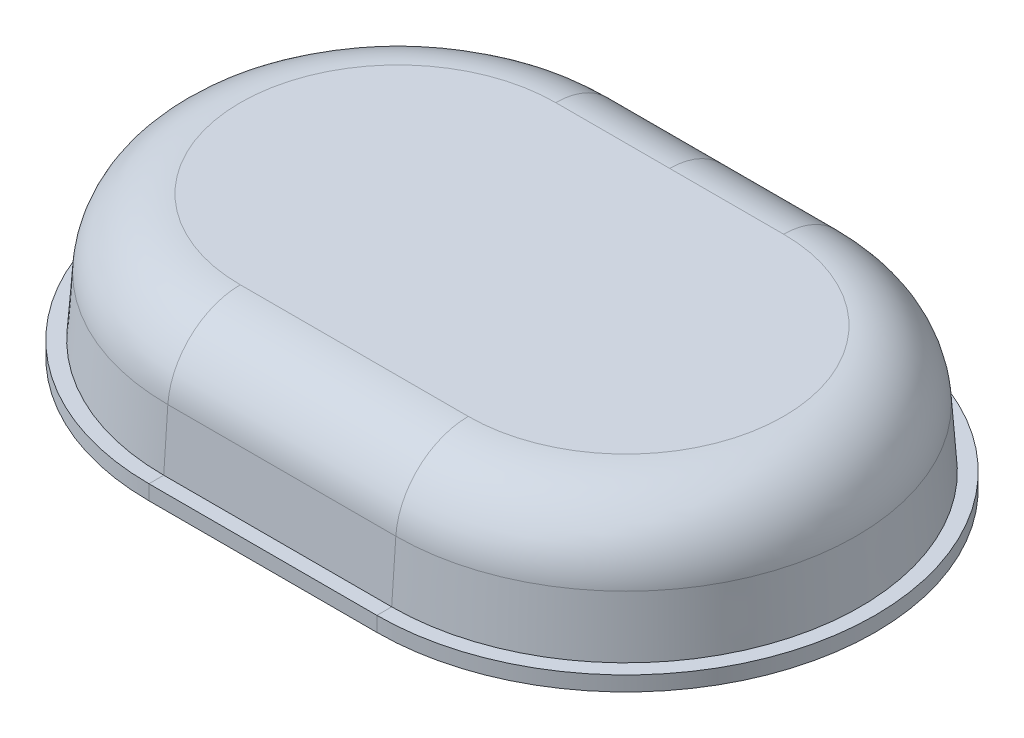
ISO-10303-21;
HEADER;
FILE_DESCRIPTION(('STEP AP214'),'2;1');
FILE_NAME('part.step','',(''),(''),'','','');
FILE_SCHEMA(('AUTOMOTIVE_DESIGN { 1 0 10303 214 1 1 1 1 }'));
ENDSEC;
DATA;
#1=APPLICATION_CONTEXT('core data for automotive mechanical design processes');
#2=APPLICATION_PROTOCOL_DEFINITION('international standard','automotive_design',2000,#1);
#3=PRODUCT_CONTEXT('',#1,'mechanical');
#4=PRODUCT('Part','Part','',(#3));
#5=PRODUCT_RELATED_PRODUCT_CATEGORY('part','',(#4));
#6=PRODUCT_DEFINITION_FORMATION('','',#4);
#7=PRODUCT_DEFINITION_CONTEXT('part definition',#1,'design');
#8=PRODUCT_DEFINITION('design','',#6,#7);
#9=PRODUCT_DEFINITION_SHAPE('','',#8);
#10=(LENGTH_UNIT() NAMED_UNIT(*) SI_UNIT(.MILLI.,.METRE.));
#11=(NAMED_UNIT(*) PLANE_ANGLE_UNIT() SI_UNIT($,.RADIAN.));
#12=(NAMED_UNIT(*) SI_UNIT($,.STERADIAN.) SOLID_ANGLE_UNIT());
#13=UNCERTAINTY_MEASURE_WITH_UNIT(LENGTH_MEASURE(1.E-05),#10,'distance_accuracy_value','');
#14=(GEOMETRIC_REPRESENTATION_CONTEXT(3) GLOBAL_UNCERTAINTY_ASSIGNED_CONTEXT((#13)) GLOBAL_UNIT_ASSIGNED_CONTEXT((#10,
#11,#12)) REPRESENTATION_CONTEXT('',''));
#15=CARTESIAN_POINT('',(0.,0.,0.));
#16=DIRECTION('',(0.,0.,1.));
#17=DIRECTION('',(1.,0.,0.));
#18=AXIS2_PLACEMENT_3D('',#15,#16,#17);
#19=CARTESIAN_POINT('',(-27.,0.,0.));
#20=DIRECTION('',(0.,1.,0.));
#21=DIRECTION('',(0.,0.,1.));
#22=AXIS2_PLACEMENT_3D('',#19,#20,#21);
#23=PLANE('',#22);
#24=DIRECTION('',(-1.,0.,0.));
#25=VECTOR('',#24,1.);
#26=CARTESIAN_POINT('',(-27.,0.,-54.));
#27=LINE('',#26,#25);
#28=CARTESIAN_POINT('',(27.0000000000002,0.,-54.0000000000008));
#29=VERTEX_POINT('',#28);
#30=CARTESIAN_POINT('',(-27.,0.,-54.));
#31=VERTEX_POINT('',#30);
#32=EDGE_CURVE('E289',#29,#31,#27,.T.);
#33=ORIENTED_EDGE('',*,*,#32,.T.);
#34=CARTESIAN_POINT('',(-27.,0.,0.));
#35=DIRECTION('',(0.,1.,0.));
#36=DIRECTION('',(0.,0.,1.));
#37=AXIS2_PLACEMENT_3D('',#34,#35,#36);
#38=CIRCLE('',#37,54.);
#39=CARTESIAN_POINT('',(-27.,0.,54.));
#40=VERTEX_POINT('',#39);
#41=EDGE_CURVE('E292',#31,#40,#38,.T.);
#42=ORIENTED_EDGE('',*,*,#41,.T.);
#43=DIRECTION('',(1.,0.,0.));
#44=VECTOR('',#43,1.);
#45=CARTESIAN_POINT('',(-27.,0.,54.));
#46=LINE('',#45,#44);
#47=CARTESIAN_POINT('',(27.,0.,54.));
#48=VERTEX_POINT('',#47);
#49=EDGE_CURVE('E350',#40,#48,#46,.T.);
#50=ORIENTED_EDGE('',*,*,#49,.T.);
#51=CARTESIAN_POINT('',(27.0000000000014,0.,-5.55111512312578E-13));
#52=DIRECTION('',(0.,1.,0.));
#53=DIRECTION('',(0.,0.,1.));
#54=AXIS2_PLACEMENT_3D('',#51,#52,#53);
#55=CIRCLE('',#54,54.0000000000003);
#56=EDGE_CURVE('E59',#48,#29,#55,.T.);
#57=ORIENTED_EDGE('',*,*,#56,.T.);
#58=EDGE_LOOP('',(#33,#42,#50,#57));
#59=FACE_BOUND('',#58,.T.);
#60=DIRECTION('',(-1.,0.,0.));
#61=VECTOR('',#60,1.);
#62=CARTESIAN_POINT('',(27.,0.,58.9999999999995));
#63=LINE('',#62,#61);
#64=CARTESIAN_POINT('',(27.,0.,58.9999999999993));
#65=VERTEX_POINT('',#64);
#66=CARTESIAN_POINT('',(-27.,0.,58.9999999999997));
#67=VERTEX_POINT('',#66);
#68=EDGE_CURVE('E245',#65,#67,#63,.T.);
#69=ORIENTED_EDGE('',*,*,#68,.T.);
#70=CARTESIAN_POINT('',(-27.,0.,0.));
#71=DIRECTION('',(0.,-1.,0.));
#72=DIRECTION('',(0.,0.,1.));
#73=AXIS2_PLACEMENT_3D('',#70,#71,#72);
#74=CIRCLE('',#73,58.9999999999997);
#75=CARTESIAN_POINT('',(-27.0000000000006,0.,-58.9999999999997));
#76=VERTEX_POINT('',#75);
#77=EDGE_CURVE('E251',#67,#76,#74,.T.);
#78=ORIENTED_EDGE('',*,*,#77,.T.);
#79=DIRECTION('',(1.,0.,0.));
#80=VECTOR('',#79,1.);
#81=CARTESIAN_POINT('',(-27.,0.,-58.9999999999997));
#82=LINE('',#81,#80);
#83=CARTESIAN_POINT('',(0.,0.,-59.));
#84=VERTEX_POINT('',#83);
#85=EDGE_CURVE('E198',#76,#84,#82,.T.);
#86=ORIENTED_EDGE('',*,*,#85,.T.);
#87=DIRECTION('',(1.,0.,0.));
#88=VECTOR('',#87,1.);
#89=CARTESIAN_POINT('',(0.,0.,-59.));
#90=LINE('',#89,#88);
#91=CARTESIAN_POINT('',(27.0000000000002,0.,-59.0000000000003));
#92=VERTEX_POINT('',#91);
#93=EDGE_CURVE('E213',#84,#92,#90,.T.);
#94=ORIENTED_EDGE('',*,*,#93,.T.);
#95=CARTESIAN_POINT('',(27.0000000000014,0.,-5.55111512312578E-13));
#96=DIRECTION('',(0.,-1.,0.));
#97=DIRECTION('',(0.,0.,-1.));
#98=AXIS2_PLACEMENT_3D('',#95,#96,#97);
#99=CIRCLE('',#98,58.9999999999999);
#100=EDGE_CURVE('E232',#92,#65,#99,.T.);
#101=ORIENTED_EDGE('',*,*,#100,.T.);
#102=EDGE_LOOP('',(#69,#78,#86,#94,#101));
#103=FACE_BOUND('',#102,.T.);
#104=ADVANCED_FACE('F35',(#59,#103),#23,.F.);
#105=CARTESIAN_POINT('',(-27.,3.39536528938381,0.));
#106=DIRECTION('',(0.,-1.,0.));
#107=DIRECTION('',(0.,0.,1.));
#108=AXIS2_PLACEMENT_3D('',#105,#106,#107);
#109=CONICAL_SURFACE('',#108,54.0036539246103,0.0698131700797733);
#110=CARTESIAN_POINT('',(-27.,17.3953652893838,0.));
#111=DIRECTION('',(0.,1.,0.));
#112=DIRECTION('',(0.,0.,1.));
#113=AXIS2_PLACEMENT_3D('',#110,#111,#112);
#114=CIRCLE('',#113,53.0246785574007);
#115=CARTESIAN_POINT('',(-27.,17.3953652893838,-53.0246785574007));
#116=VERTEX_POINT('',#115);
#117=CARTESIAN_POINT('',(-27.,17.3953652893838,53.0246785574007));
#118=VERTEX_POINT('',#117);
#119=EDGE_CURVE('E277',#116,#118,#114,.T.);
#120=ORIENTED_EDGE('',*,*,#119,.T.);
#121=DIRECTION('',(0.,-0.997564050259824,0.0697564737441255));
#122=VECTOR('',#121,1.);
#123=CARTESIAN_POINT('',(-27.,3.39536528938381,54.0036539246103));
#124=LINE('',#123,#122);
#125=CARTESIAN_POINT('',(-26.9999999999999,3.44761884576238,54.));
#126=VERTEX_POINT('',#125);
#127=EDGE_CURVE('E290',#118,#126,#124,.T.);
#128=ORIENTED_EDGE('',*,*,#127,.T.);
#129=CARTESIAN_POINT('',(-27.,3.44761884576236,0.));
#130=DIRECTION('',(0.,-1.,0.));
#131=DIRECTION('',(0.,0.,-1.));
#132=AXIS2_PLACEMENT_3D('',#129,#130,#131);
#133=CIRCLE('',#132,54.);
#134=CARTESIAN_POINT('',(-27.0000000000003,3.44761884576232,-54.));
#135=VERTEX_POINT('',#134);
#136=EDGE_CURVE('E285',#135,#126,#133,.F.);
#137=ORIENTED_EDGE('',*,*,#136,.F.);
#138=DIRECTION('',(0.,-0.997564050259824,-0.0697564737441255));
#139=VECTOR('',#138,1.);
#140=CARTESIAN_POINT('',(-27.,3.39536528938381,-54.0036539246103));
#141=LINE('',#140,#139);
#142=EDGE_CURVE('E281',#116,#135,#141,.T.);
#143=ORIENTED_EDGE('',*,*,#142,.F.);
#144=EDGE_LOOP('',(#120,#128,#137,#143));
#145=FACE_BOUND('',#144,.T.);
#146=ADVANCED_FACE('F475',(#145),#109,.F.);
#147=CARTESIAN_POINT('',(-27.,3.39536528938381,54.0036539246103));
#148=DIRECTION('',(0.,0.0697564737441255,0.997564050259824));
#149=DIRECTION('',(0.,-0.997564050259824,0.0697564737441255));
#150=AXIS2_PLACEMENT_3D('',#147,#148,#149);
#151=PLANE('',#150);
#152=DIRECTION('',(1.,0.,0.));
#153=VECTOR('',#152,1.);
#154=CARTESIAN_POINT('',(-26.9999999999998,17.3953652893838,53.0246785574007));
#155=LINE('',#154,#153);
#156=CARTESIAN_POINT('',(27.0000000000001,17.3953652893838,53.0246785574004));
#157=VERTEX_POINT('',#156);
#158=EDGE_CURVE('E294',#118,#157,#155,.T.);
#159=ORIENTED_EDGE('',*,*,#158,.T.);
#160=DIRECTION('',(0.,-0.997564050259824,0.0697564737441255));
#161=VECTOR('',#160,1.);
#162=CARTESIAN_POINT('',(27.0000000000001,3.39536528938381,54.0036539246099));
#163=LINE('',#162,#161);
#164=CARTESIAN_POINT('',(27.0000000000009,3.44761884576043,53.9999999999999));
#165=VERTEX_POINT('',#164);
#166=EDGE_CURVE('E293',#157,#165,#163,.T.);
#167=ORIENTED_EDGE('',*,*,#166,.T.);
#168=DIRECTION('',(-1.,0.,0.));
#169=VECTOR('',#168,1.);
#170=CARTESIAN_POINT('',(-27.,3.44761884576236,54.));
#171=LINE('',#170,#169);
#172=EDGE_CURVE('E288',#126,#165,#171,.F.);
#173=ORIENTED_EDGE('',*,*,#172,.F.);
#174=ORIENTED_EDGE('',*,*,#127,.F.);
#175=EDGE_LOOP('',(#159,#167,#173,#174));
#176=FACE_BOUND('',#175,.T.);
#177=ADVANCED_FACE('F480',(#176),#151,.F.);
#178=CARTESIAN_POINT('',(27.0000000000014,3.39536528938381,-5.55111512312578E-13));
#179=DIRECTION('',(0.,-1.,0.));
#180=DIRECTION('',(0.,0.,1.));
#181=AXIS2_PLACEMENT_3D('',#178,#179,#180);
#182=CONICAL_SURFACE('',#181,54.0036539246105,0.0698131700797733);
#183=CARTESIAN_POINT('',(27.0000000000014,17.3953652893838,-5.55111512312578E-13));
#184=DIRECTION('',(0.,1.,0.));
#185=DIRECTION('',(0.,0.,1.));
#186=AXIS2_PLACEMENT_3D('',#183,#184,#185);
#187=CIRCLE('',#186,53.0246785574009);
#188=CARTESIAN_POINT('',(27.0000000000003,17.3953652893838,-53.0246785574015));
#189=VERTEX_POINT('',#188);
#190=EDGE_CURVE('E301',#157,#189,#187,.T.);
#191=ORIENTED_EDGE('',*,*,#190,.T.);
#192=DIRECTION('',(0.,0.997564050259824,0.0697564737441255));
#193=VECTOR('',#192,1.);
#194=CARTESIAN_POINT('',(27.0000000000003,3.39536528938381,-54.003653924611));
#195=LINE('',#194,#193);
#196=CARTESIAN_POINT('',(27.0000000000005,3.44761884576337,-54.0000000000007));
#197=VERTEX_POINT('',#196);
#198=EDGE_CURVE('E283',#189,#197,#195,.F.);
#199=ORIENTED_EDGE('',*,*,#198,.T.);
#200=CARTESIAN_POINT('',(27.0000000000014,3.44761884576137,-5.55111512312578E-13));
#201=DIRECTION('',(0.,-1.,0.));
#202=DIRECTION('',(0.,0.,-1.));
#203=AXIS2_PLACEMENT_3D('',#200,#201,#202);
#204=CIRCLE('',#203,54.0000000000003);
#205=EDGE_CURVE('E299',#165,#197,#204,.F.);
#206=ORIENTED_EDGE('',*,*,#205,.F.);
#207=ORIENTED_EDGE('',*,*,#166,.F.);
#208=EDGE_LOOP('',(#191,#199,#206,#207));
#209=FACE_BOUND('',#208,.T.);
#210=ADVANCED_FACE('F500',(#209),#182,.F.);
#211=CARTESIAN_POINT('',(27.0000000000002,3.39536528938381,-54.003653924611));
#212=DIRECTION('',(0.,0.0697564737441255,-0.997564050259824));
#213=DIRECTION('',(0.,0.997564050259824,0.0697564737441255));
#214=AXIS2_PLACEMENT_3D('',#211,#212,#213);
#215=PLANE('',#214);
#216=DIRECTION('',(-1.,0.,0.));
#217=VECTOR('',#216,1.);
#218=CARTESIAN_POINT('',(-2.13322755577671E-13,17.3953652893838,-53.0246785574011));
#219=LINE('',#218,#217);
#220=CARTESIAN_POINT('',(0.,17.3953652893838,-53.0246785574011));
#221=VERTEX_POINT('',#220);
#222=EDGE_CURVE('E310',#221,#116,#219,.T.);
#223=ORIENTED_EDGE('',*,*,#222,.T.);
#224=ORIENTED_EDGE('',*,*,#142,.T.);
#225=DIRECTION('',(1.,0.,0.));
#226=VECTOR('',#225,1.);
#227=CARTESIAN_POINT('',(27.0000000000002,3.44761884576435,-54.0000000000006));
#228=LINE('',#227,#226);
#229=EDGE_CURVE('E308',#197,#135,#228,.F.);
#230=ORIENTED_EDGE('',*,*,#229,.F.);
#231=ORIENTED_EDGE('',*,*,#198,.F.);
#232=DIRECTION('',(-1.,0.,0.));
#233=VECTOR('',#232,1.);
#234=CARTESIAN_POINT('',(27.0000000000001,17.3953652893838,-53.0246785574015));
#235=LINE('',#234,#233);
#236=EDGE_CURVE('E284',#189,#221,#235,.T.);
#237=ORIENTED_EDGE('',*,*,#236,.T.);
#238=EDGE_LOOP('',(#223,#224,#230,#231,#237));
#239=FACE_BOUND('',#238,.T.);
#240=ADVANCED_FACE('F505',(#239),#215,.F.);
#241=CARTESIAN_POINT('',(-27.,3.5,0.));
#242=DIRECTION('',(0.,-1.,0.));
#243=DIRECTION('',(0.,0.,-1.));
#244=AXIS2_PLACEMENT_3D('',#241,#242,#243);
#245=CYLINDRICAL_SURFACE('',#244,54.);
#246=ORIENTED_EDGE('',*,*,#41,.F.);
#247=DIRECTION('',(0.,-1.,0.));
#248=VECTOR('',#247,1.);
#249=CARTESIAN_POINT('',(-27.,3.5,-54.));
#250=LINE('',#249,#248);
#251=EDGE_CURVE('E318',#135,#31,#250,.T.);
#252=ORIENTED_EDGE('',*,*,#251,.F.);
#253=ORIENTED_EDGE('',*,*,#136,.T.);
#254=DIRECTION('',(0.,1.,0.));
#255=VECTOR('',#254,1.);
#256=CARTESIAN_POINT('',(-27.,3.5,54.));
#257=LINE('',#256,#255);
#258=EDGE_CURVE('E319',#126,#40,#257,.F.);
#259=ORIENTED_EDGE('',*,*,#258,.T.);
#260=EDGE_LOOP('',(#246,#252,#253,#259));
#261=FACE_BOUND('',#260,.T.);
#262=ADVANCED_FACE('F490',(#261),#245,.F.);
#263=CARTESIAN_POINT('',(-27.,3.5,54.));
#264=DIRECTION('',(0.,0.,-1.));
#265=DIRECTION('',(-1.,0.,0.));
#266=AXIS2_PLACEMENT_3D('',#263,#264,#265);
#267=PLANE('',#266);
#268=ORIENTED_EDGE('',*,*,#49,.F.);
#269=ORIENTED_EDGE('',*,*,#258,.F.);
#270=ORIENTED_EDGE('',*,*,#172,.T.);
#271=DIRECTION('',(0.,-1.,0.));
#272=VECTOR('',#271,1.);
#273=CARTESIAN_POINT('',(27.0000000000001,3.5,53.9999999999997));
#274=LINE('',#273,#272);
#275=EDGE_CURVE('E323',#165,#48,#274,.T.);
#276=ORIENTED_EDGE('',*,*,#275,.T.);
#277=EDGE_LOOP('',(#268,#269,#270,#276));
#278=FACE_BOUND('',#277,.T.);
#279=ADVANCED_FACE('F494',(#278),#267,.T.);
#280=CARTESIAN_POINT('',(27.0000000000014,3.5,-5.55111512312578E-13));
#281=DIRECTION('',(0.,-1.,0.));
#282=DIRECTION('',(0.,0.,-1.));
#283=AXIS2_PLACEMENT_3D('',#280,#281,#282);
#284=CYLINDRICAL_SURFACE('',#283,54.0000000000003);
#285=ORIENTED_EDGE('',*,*,#56,.F.);
#286=ORIENTED_EDGE('',*,*,#275,.F.);
#287=ORIENTED_EDGE('',*,*,#205,.T.);
#288=DIRECTION('',(0.,1.,0.));
#289=VECTOR('',#288,1.);
#290=CARTESIAN_POINT('',(27.0000000000002,3.5,-54.0000000000006));
#291=LINE('',#290,#289);
#292=EDGE_CURVE('E325',#197,#29,#291,.F.);
#293=ORIENTED_EDGE('',*,*,#292,.T.);
#294=EDGE_LOOP('',(#285,#286,#287,#293));
#295=FACE_BOUND('',#294,.T.);
#296=ADVANCED_FACE('F497',(#295),#284,.F.);
#297=CARTESIAN_POINT('',(-27.,3.5,-54.));
#298=DIRECTION('',(0.,0.,1.));
#299=DIRECTION('',(1.,0.,0.));
#300=AXIS2_PLACEMENT_3D('',#297,#298,#299);
#301=PLANE('',#300);
#302=ORIENTED_EDGE('',*,*,#32,.F.);
#303=ORIENTED_EDGE('',*,*,#292,.F.);
#304=ORIENTED_EDGE('',*,*,#229,.T.);
#305=ORIENTED_EDGE('',*,*,#251,.T.);
#306=EDGE_LOOP('',(#302,#303,#304,#305));
#307=FACE_BOUND('',#306,.T.);
#308=ADVANCED_FACE('F486',(#307),#301,.T.);
#309=CARTESIAN_POINT('',(0.,16.30020279808,-37.3631252723959));
#310=DIRECTION('',(-1.,0.,0.));
#311=DIRECTION('',(0.,0.,1.));
#312=AXIS2_PLACEMENT_3D('',#309,#310,#311);
#313=CYLINDRICAL_SURFACE('',#312,15.69979720192);
#314=ORIENTED_EDGE('',*,*,#222,.F.);
#315=CARTESIAN_POINT('',(0.,16.30020279808,-37.3631252723959));
#316=DIRECTION('',(-1.,0.,0.));
#317=DIRECTION('',(0.,0.,1.));
#318=AXIS2_PLACEMENT_3D('',#315,#316,#317);
#319=CIRCLE('',#318,15.69979720192);
#320=CARTESIAN_POINT('',(0.,32.,-37.3631252723959));
#321=VERTEX_POINT('',#320);
#322=EDGE_CURVE('E269',#321,#221,#319,.T.);
#323=ORIENTED_EDGE('',*,*,#322,.F.);
#324=DIRECTION('',(1.,0.,0.));
#325=VECTOR('',#324,1.);
#326=CARTESIAN_POINT('',(-27.,32.,-37.3631252723959));
#327=LINE('',#326,#325);
#328=CARTESIAN_POINT('',(-27.,32.,-37.3631252723956));
#329=VERTEX_POINT('',#328);
#330=EDGE_CURVE('E330',#321,#329,#327,.F.);
#331=ORIENTED_EDGE('',*,*,#330,.T.);
#332=CARTESIAN_POINT('',(-27.,16.30020279808,-37.3631252723956));
#333=DIRECTION('',(1.,0.,0.));
#334=DIRECTION('',(0.,0.,-1.));
#335=AXIS2_PLACEMENT_3D('',#332,#333,#334);
#336=CIRCLE('',#335,15.69979720192);
#337=EDGE_CURVE('E313',#329,#116,#336,.F.);
#338=ORIENTED_EDGE('',*,*,#337,.T.);
#339=EDGE_LOOP('',(#314,#323,#331,#338));
#340=FACE_BOUND('',#339,.T.);
#341=ADVANCED_FACE('F523',(#340),#313,.F.);
#342=CARTESIAN_POINT('',(-27.,16.30020279808,0.));
#343=DIRECTION('',(0.,1.,0.));
#344=DIRECTION('',(0.,0.,1.));
#345=AXIS2_PLACEMENT_3D('',#342,#343,#344);
#346=TOROIDAL_SURFACE('',#345,37.3631252723956,15.69979720192);
#347=ORIENTED_EDGE('',*,*,#119,.F.);
#348=ORIENTED_EDGE('',*,*,#337,.F.);
#349=CARTESIAN_POINT('',(-27.,32.,0.));
#350=DIRECTION('',(0.,1.,0.));
#351=DIRECTION('',(0.,0.,1.));
#352=AXIS2_PLACEMENT_3D('',#349,#350,#351);
#353=CIRCLE('',#352,37.3631252723956);
#354=CARTESIAN_POINT('',(-26.9999999999998,32.,37.3631252723956));
#355=VERTEX_POINT('',#354);
#356=EDGE_CURVE('E312',#329,#355,#353,.T.);
#357=ORIENTED_EDGE('',*,*,#356,.T.);
#358=CARTESIAN_POINT('',(-26.9999999999998,16.30020279808,37.3631252723956));
#359=DIRECTION('',(1.,0.,0.));
#360=DIRECTION('',(0.,0.,-1.));
#361=AXIS2_PLACEMENT_3D('',#358,#359,#360);
#362=CIRCLE('',#361,15.69979720192);
#363=EDGE_CURVE('E280',#355,#118,#362,.T.);
#364=ORIENTED_EDGE('',*,*,#363,.T.);
#365=EDGE_LOOP('',(#347,#348,#357,#364));
#366=FACE_BOUND('',#365,.T.);
#367=ADVANCED_FACE('F525',(#366),#346,.F.);
#368=CARTESIAN_POINT('',(-26.9999999999999,16.30020279808,37.3631252723956));
#369=DIRECTION('',(1.,0.,0.));
#370=DIRECTION('',(0.,0.,-1.));
#371=AXIS2_PLACEMENT_3D('',#368,#369,#370);
#372=CYLINDRICAL_SURFACE('',#371,15.69979720192);
#373=ORIENTED_EDGE('',*,*,#158,.F.);
#374=ORIENTED_EDGE('',*,*,#363,.F.);
#375=DIRECTION('',(1.,0.,0.));
#376=VECTOR('',#375,1.);
#377=CARTESIAN_POINT('',(-27.,32.,37.3631252723956));
#378=LINE('',#377,#376);
#379=CARTESIAN_POINT('',(27.0000000000002,32.,37.3631252723952));
#380=VERTEX_POINT('',#379);
#381=EDGE_CURVE('E279',#355,#380,#378,.T.);
#382=ORIENTED_EDGE('',*,*,#381,.T.);
#383=CARTESIAN_POINT('',(27.0000000000004,16.30020279808,37.3631252723952));
#384=DIRECTION('',(-1.,0.,0.));
#385=DIRECTION('',(0.,0.,1.));
#386=AXIS2_PLACEMENT_3D('',#383,#384,#385);
#387=CIRCLE('',#386,15.69979720192);
#388=EDGE_CURVE('E296',#380,#157,#387,.F.);
#389=ORIENTED_EDGE('',*,*,#388,.T.);
#390=EDGE_LOOP('',(#373,#374,#382,#389));
#391=FACE_BOUND('',#390,.T.);
#392=ADVANCED_FACE('F515',(#391),#372,.F.);
#393=CARTESIAN_POINT('',(27.0000000000014,16.30020279808,-5.55111512312578E-13));
#394=DIRECTION('',(0.,1.,0.));
#395=DIRECTION('',(0.,0.,1.));
#396=AXIS2_PLACEMENT_3D('',#393,#394,#395);
#397=TOROIDAL_SURFACE('',#396,37.3631252723958,15.69979720192);
#398=ORIENTED_EDGE('',*,*,#190,.F.);
#399=ORIENTED_EDGE('',*,*,#388,.F.);
#400=CARTESIAN_POINT('',(27.0000000000014,32.,-5.55111512312578E-13));
#401=DIRECTION('',(0.,1.,0.));
#402=DIRECTION('',(0.,0.,1.));
#403=AXIS2_PLACEMENT_3D('',#400,#401,#402);
#404=CIRCLE('',#403,37.3631252723958);
#405=CARTESIAN_POINT('',(27.0000000000007,32.,-37.3631252723963));
#406=VERTEX_POINT('',#405);
#407=EDGE_CURVE('E340',#380,#406,#404,.T.);
#408=ORIENTED_EDGE('',*,*,#407,.T.);
#409=CARTESIAN_POINT('',(27.0000000000007,16.30020279808,-37.3631252723963));
#410=DIRECTION('',(-1.,0.,0.));
#411=DIRECTION('',(0.,0.,1.));
#412=AXIS2_PLACEMENT_3D('',#409,#410,#411);
#413=CIRCLE('',#412,15.69979720192);
#414=EDGE_CURVE('E305',#406,#189,#413,.T.);
#415=ORIENTED_EDGE('',*,*,#414,.T.);
#416=EDGE_LOOP('',(#398,#399,#408,#415));
#417=FACE_BOUND('',#416,.T.);
#418=ADVANCED_FACE('F517',(#417),#397,.F.);
#419=CARTESIAN_POINT('',(27.0000000000003,16.30020279808,-37.3631252723963));
#420=DIRECTION('',(-1.,0.,0.));
#421=DIRECTION('',(0.,0.,1.));
#422=AXIS2_PLACEMENT_3D('',#419,#420,#421);
#423=CYLINDRICAL_SURFACE('',#422,15.69979720192);
#424=DIRECTION('',(1.,0.,0.));
#425=VECTOR('',#424,1.);
#426=CARTESIAN_POINT('',(-27.,32.,-37.3631252723963));
#427=LINE('',#426,#425);
#428=EDGE_CURVE('E304',#406,#321,#427,.F.);
#429=ORIENTED_EDGE('',*,*,#428,.T.);
#430=ORIENTED_EDGE('',*,*,#322,.T.);
#431=ORIENTED_EDGE('',*,*,#236,.F.);
#432=ORIENTED_EDGE('',*,*,#414,.F.);
#433=EDGE_LOOP('',(#429,#430,#431,#432));
#434=FACE_BOUND('',#433,.T.);
#435=ADVANCED_FACE('F470',(#434),#423,.F.);
#436=CARTESIAN_POINT('',(-27.,32.,0.));
#437=DIRECTION('',(0.,1.,0.));
#438=DIRECTION('',(0.,0.,1.));
#439=AXIS2_PLACEMENT_3D('',#436,#437,#438);
#440=PLANE('',#439);
#441=ORIENTED_EDGE('',*,*,#330,.F.);
#442=ORIENTED_EDGE('',*,*,#428,.F.);
#443=ORIENTED_EDGE('',*,*,#407,.F.);
#444=ORIENTED_EDGE('',*,*,#381,.F.);
#445=ORIENTED_EDGE('',*,*,#356,.F.);
#446=EDGE_LOOP('',(#441,#442,#443,#444,#445));
#447=FACE_BOUND('',#446,.T.);
#448=ADVANCED_FACE('F463',(#447),#440,.F.);
#449=CARTESIAN_POINT('',(-27.,3.5,-55.4999999999997));
#450=DIRECTION('',(0.,1.,0.));
#451=DIRECTION('',(0.,0.,1.));
#452=AXIS2_PLACEMENT_3D('',#449,#450,#451);
#453=PLANE('',#452);
#454=DIRECTION('',(1.,0.,0.));
#455=VECTOR('',#454,1.);
#456=CARTESIAN_POINT('',(-27.,3.5,-58.9999999999997));
#457=LINE('',#456,#455);
#458=CARTESIAN_POINT('',(-27.0000000000006,3.5,-58.9999999999997));
#459=VERTEX_POINT('',#458);
#460=CARTESIAN_POINT('',(0.,3.5,-59.));
#461=VERTEX_POINT('',#460);
#462=EDGE_CURVE('E207',#459,#461,#457,.T.);
#463=ORIENTED_EDGE('',*,*,#462,.F.);
#464=DIRECTION('',(0.,0.,1.));
#465=VECTOR('',#464,1.);
#466=CARTESIAN_POINT('',(-27.0000000000006,3.5,-55.4999999999997));
#467=LINE('',#466,#465);
#468=CARTESIAN_POINT('',(-27.0000000000006,3.5,-55.4999999999997));
#469=VERTEX_POINT('',#468);
#470=EDGE_CURVE('E254',#459,#469,#467,.T.);
#471=ORIENTED_EDGE('',*,*,#470,.T.);
#472=DIRECTION('',(1.,0.,0.));
#473=VECTOR('',#472,1.);
#474=CARTESIAN_POINT('',(-27.,3.5,-55.4999999999997));
#475=LINE('',#474,#473);
#476=CARTESIAN_POINT('',(0.,3.5,-55.5000000000003));
#477=VERTEX_POINT('',#476);
#478=EDGE_CURVE('E258',#469,#477,#475,.T.);
#479=ORIENTED_EDGE('',*,*,#478,.T.);
#480=DIRECTION('',(0.,0.,1.));
#481=VECTOR('',#480,1.);
#482=CARTESIAN_POINT('',(0.,3.5,-55.5));
#483=LINE('',#482,#481);
#484=EDGE_CURVE('E51',#461,#477,#483,.T.);
#485=ORIENTED_EDGE('',*,*,#484,.F.);
#486=EDGE_LOOP('',(#463,#471,#479,#485));
#487=FACE_BOUND('',#486,.T.);
#488=ADVANCED_FACE('F461',(#487),#453,.T.);
#489=CARTESIAN_POINT('',(-27.,3.5,55.4999999999997));
#490=DIRECTION('',(0.,1.,0.));
#491=DIRECTION('',(0.,0.,1.));
#492=AXIS2_PLACEMENT_3D('',#489,#490,#491);
#493=PLANE('',#492);
#494=CARTESIAN_POINT('',(-27.,3.5,0.));
#495=DIRECTION('',(0.,1.,0.));
#496=DIRECTION('',(0.,0.,1.));
#497=AXIS2_PLACEMENT_3D('',#494,#495,#496);
#498=CIRCLE('',#497,55.5);
#499=CARTESIAN_POINT('',(-27.,3.5,55.4999999999997));
#500=VERTEX_POINT('',#499);
#501=EDGE_CURVE('E399',#469,#500,#498,.T.);
#502=ORIENTED_EDGE('',*,*,#501,.F.);
#503=ORIENTED_EDGE('',*,*,#470,.F.);
#504=CARTESIAN_POINT('',(-27.,3.5,0.));
#505=DIRECTION('',(0.,-1.,0.));
#506=DIRECTION('',(0.,0.,1.));
#507=AXIS2_PLACEMENT_3D('',#504,#505,#506);
#508=CIRCLE('',#507,58.9999999999997);
#509=CARTESIAN_POINT('',(-27.,3.5,58.9999999999997));
#510=VERTEX_POINT('',#509);
#511=EDGE_CURVE('E250',#510,#459,#508,.T.);
#512=ORIENTED_EDGE('',*,*,#511,.F.);
#513=DIRECTION('',(0.,0.,-1.));
#514=VECTOR('',#513,1.);
#515=CARTESIAN_POINT('',(-27.,3.5,55.4999999999997));
#516=LINE('',#515,#514);
#517=EDGE_CURVE('E242',#510,#500,#516,.T.);
#518=ORIENTED_EDGE('',*,*,#517,.T.);
#519=EDGE_LOOP('',(#502,#503,#512,#518));
#520=FACE_BOUND('',#519,.T.);
#521=ADVANCED_FACE('F433',(#520),#493,.T.);
#522=CARTESIAN_POINT('',(-27.,0.,0.));
#523=DIRECTION('',(0.,-1.,0.));
#524=DIRECTION('',(0.,0.,-1.));
#525=AXIS2_PLACEMENT_3D('',#522,#523,#524);
#526=CYLINDRICAL_SURFACE('',#525,58.9999999999997);
#527=ORIENTED_EDGE('',*,*,#511,.T.);
#528=DIRECTION('',(0.,1.,0.));
#529=VECTOR('',#528,1.);
#530=CARTESIAN_POINT('',(-27.0000000000006,3.5,-58.9999999999997));
#531=LINE('',#530,#529);
#532=EDGE_CURVE('E248',#76,#459,#531,.T.);
#533=ORIENTED_EDGE('',*,*,#532,.F.);
#534=ORIENTED_EDGE('',*,*,#77,.F.);
#535=DIRECTION('',(0.,1.,0.));
#536=VECTOR('',#535,1.);
#537=CARTESIAN_POINT('',(-27.,3.5,58.9999999999997));
#538=LINE('',#537,#536);
#539=EDGE_CURVE('E239',#67,#510,#538,.T.);
#540=ORIENTED_EDGE('',*,*,#539,.T.);
#541=EDGE_LOOP('',(#527,#533,#534,#540));
#542=FACE_BOUND('',#541,.T.);
#543=ADVANCED_FACE('F435',(#542),#526,.T.);
#544=CARTESIAN_POINT('',(27.0000000000001,3.5,55.4999999999995));
#545=DIRECTION('',(0.,1.,0.));
#546=DIRECTION('',(0.,0.,1.));
#547=AXIS2_PLACEMENT_3D('',#544,#545,#546);
#548=PLANE('',#547);
#549=DIRECTION('',(1.,0.,0.));
#550=VECTOR('',#549,1.);
#551=CARTESIAN_POINT('',(-27.,3.5,55.5));
#552=LINE('',#551,#550);
#553=CARTESIAN_POINT('',(27.0000000000001,3.5,55.4999999999993));
#554=VERTEX_POINT('',#553);
#555=EDGE_CURVE('E410',#500,#554,#552,.T.);
#556=ORIENTED_EDGE('',*,*,#555,.F.);
#557=ORIENTED_EDGE('',*,*,#517,.F.);
#558=DIRECTION('',(-1.,0.,0.));
#559=VECTOR('',#558,1.);
#560=CARTESIAN_POINT('',(27.,3.5,58.9999999999995));
#561=LINE('',#560,#559);
#562=CARTESIAN_POINT('',(27.,3.5,58.9999999999993));
#563=VERTEX_POINT('',#562);
#564=EDGE_CURVE('E243',#563,#510,#561,.T.);
#565=ORIENTED_EDGE('',*,*,#564,.F.);
#566=DIRECTION('',(0.,0.,-1.));
#567=VECTOR('',#566,1.);
#568=CARTESIAN_POINT('',(27.0000000000001,3.5,55.4999999999993));
#569=LINE('',#568,#567);
#570=EDGE_CURVE('E235',#563,#554,#569,.T.);
#571=ORIENTED_EDGE('',*,*,#570,.T.);
#572=EDGE_LOOP('',(#556,#557,#565,#571));
#573=FACE_BOUND('',#572,.T.);
#574=ADVANCED_FACE('F424',(#573),#548,.T.);
#575=CARTESIAN_POINT('',(27.,3.5,58.9999999999995));
#576=DIRECTION('',(0.,0.,1.));
#577=DIRECTION('',(1.,0.,0.));
#578=AXIS2_PLACEMENT_3D('',#575,#576,#577);
#579=PLANE('',#578);
#580=ORIENTED_EDGE('',*,*,#564,.T.);
#581=ORIENTED_EDGE('',*,*,#539,.F.);
#582=ORIENTED_EDGE('',*,*,#68,.F.);
#583=DIRECTION('',(0.,1.,0.));
#584=VECTOR('',#583,1.);
#585=CARTESIAN_POINT('',(27.,3.5,58.9999999999993));
#586=LINE('',#585,#584);
#587=EDGE_CURVE('E228',#65,#563,#586,.T.);
#588=ORIENTED_EDGE('',*,*,#587,.T.);
#589=EDGE_LOOP('',(#580,#581,#582,#588));
#590=FACE_BOUND('',#589,.T.);
#591=ADVANCED_FACE('F429',(#590),#579,.T.);
#592=CARTESIAN_POINT('',(27.0000000000008,3.5,-55.5000000000004));
#593=DIRECTION('',(0.,1.,0.));
#594=DIRECTION('',(0.,0.,1.));
#595=AXIS2_PLACEMENT_3D('',#592,#593,#594);
#596=PLANE('',#595);
#597=CARTESIAN_POINT('',(27.0000000000014,3.5,-5.55111512312578E-13));
#598=DIRECTION('',(0.,1.,0.));
#599=DIRECTION('',(0.,0.,-1.));
#600=AXIS2_PLACEMENT_3D('',#597,#598,#599);
#601=CIRCLE('',#600,55.5000000000003);
#602=CARTESIAN_POINT('',(27.0000000000002,3.5,-55.5000000000003));
#603=VERTEX_POINT('',#602);
#604=EDGE_CURVE('E43',#554,#603,#601,.T.);
#605=ORIENTED_EDGE('',*,*,#604,.F.);
#606=ORIENTED_EDGE('',*,*,#570,.F.);
#607=CARTESIAN_POINT('',(27.0000000000014,3.5,-5.55111512312578E-13));
#608=DIRECTION('',(0.,-1.,0.));
#609=DIRECTION('',(0.,0.,-1.));
#610=AXIS2_PLACEMENT_3D('',#607,#608,#609);
#611=CIRCLE('',#610,58.9999999999999);
#612=CARTESIAN_POINT('',(27.0000000000002,3.5,-59.0000000000003));
#613=VERTEX_POINT('',#612);
#614=EDGE_CURVE('E231',#613,#563,#611,.T.);
#615=ORIENTED_EDGE('',*,*,#614,.F.);
#616=DIRECTION('',(0.,0.,1.));
#617=VECTOR('',#616,1.);
#618=CARTESIAN_POINT('',(27.0000000000002,3.5,-55.5000000000003));
#619=LINE('',#618,#617);
#620=EDGE_CURVE('E226',#613,#603,#619,.T.);
#621=ORIENTED_EDGE('',*,*,#620,.T.);
#622=EDGE_LOOP('',(#605,#606,#615,#621));
#623=FACE_BOUND('',#622,.T.);
#624=ADVANCED_FACE('F421',(#623),#596,.T.);
#625=CARTESIAN_POINT('',(27.0000000000014,0.,-5.55111512312578E-13));
#626=DIRECTION('',(0.,-1.,0.));
#627=DIRECTION('',(0.,0.,-1.));
#628=AXIS2_PLACEMENT_3D('',#625,#626,#627);
#629=CYLINDRICAL_SURFACE('',#628,58.9999999999999);
#630=ORIENTED_EDGE('',*,*,#614,.T.);
#631=ORIENTED_EDGE('',*,*,#587,.F.);
#632=ORIENTED_EDGE('',*,*,#100,.F.);
#633=DIRECTION('',(0.,1.,0.));
#634=VECTOR('',#633,1.);
#635=CARTESIAN_POINT('',(27.0000000000002,3.5,-59.0000000000003));
#636=LINE('',#635,#634);
#637=EDGE_CURVE('E218',#92,#613,#636,.T.);
#638=ORIENTED_EDGE('',*,*,#637,.T.);
#639=EDGE_LOOP('',(#630,#631,#632,#638));
#640=FACE_BOUND('',#639,.T.);
#641=ADVANCED_FACE('F438',(#640),#629,.T.);
#642=CARTESIAN_POINT('',(0.,3.5,-55.5));
#643=DIRECTION('',(0.,1.,0.));
#644=DIRECTION('',(0.,0.,1.));
#645=AXIS2_PLACEMENT_3D('',#642,#643,#644);
#646=PLANE('',#645);
#647=DIRECTION('',(-1.,0.,0.));
#648=VECTOR('',#647,1.);
#649=CARTESIAN_POINT('',(-27.,3.5,-55.5));
#650=LINE('',#649,#648);
#651=EDGE_CURVE('E11',#603,#477,#650,.T.);
#652=ORIENTED_EDGE('',*,*,#651,.F.);
#653=ORIENTED_EDGE('',*,*,#620,.F.);
#654=DIRECTION('',(1.,0.,0.));
#655=VECTOR('',#654,1.);
#656=CARTESIAN_POINT('',(0.,3.5,-59.));
#657=LINE('',#656,#655);
#658=EDGE_CURVE('E225',#461,#613,#657,.T.);
#659=ORIENTED_EDGE('',*,*,#658,.F.);
#660=ORIENTED_EDGE('',*,*,#484,.T.);
#661=EDGE_LOOP('',(#652,#653,#659,#660));
#662=FACE_BOUND('',#661,.T.);
#663=ADVANCED_FACE('F439',(#662),#646,.T.);
#664=CARTESIAN_POINT('',(0.,3.5,-59.));
#665=DIRECTION('',(0.,0.,-1.));
#666=DIRECTION('',(-1.,0.,0.));
#667=AXIS2_PLACEMENT_3D('',#664,#665,#666);
#668=PLANE('',#667);
#669=ORIENTED_EDGE('',*,*,#658,.T.);
#670=ORIENTED_EDGE('',*,*,#637,.F.);
#671=ORIENTED_EDGE('',*,*,#93,.F.);
#672=DIRECTION('',(0.,1.,0.));
#673=VECTOR('',#672,1.);
#674=CARTESIAN_POINT('',(0.,3.5,-59.));
#675=LINE('',#674,#673);
#676=EDGE_CURVE('E216',#84,#461,#675,.T.);
#677=ORIENTED_EDGE('',*,*,#676,.T.);
#678=EDGE_LOOP('',(#669,#670,#671,#677));
#679=FACE_BOUND('',#678,.T.);
#680=ADVANCED_FACE('F215',(#679),#668,.T.);
#681=CARTESIAN_POINT('',(-27.,3.5,-58.9999999999997));
#682=DIRECTION('',(0.,0.,-1.));
#683=DIRECTION('',(-1.,0.,0.));
#684=AXIS2_PLACEMENT_3D('',#681,#682,#683);
#685=PLANE('',#684);
#686=ORIENTED_EDGE('',*,*,#532,.T.);
#687=ORIENTED_EDGE('',*,*,#462,.T.);
#688=ORIENTED_EDGE('',*,*,#676,.F.);
#689=ORIENTED_EDGE('',*,*,#85,.F.);
#690=EDGE_LOOP('',(#686,#687,#688,#689));
#691=FACE_BOUND('',#690,.T.);
#692=ADVANCED_FACE('F220',(#691),#685,.T.);
#693=CARTESIAN_POINT('',(-27.,33.5,0.));
#694=DIRECTION('',(0.,1.,0.));
#695=DIRECTION('',(0.,0.,1.));
#696=AXIS2_PLACEMENT_3D('',#693,#694,#695);
#697=PLANE('',#696);
#698=DIRECTION('',(-1.,0.,0.));
#699=VECTOR('',#698,1.);
#700=CARTESIAN_POINT('',(0.,33.5,-37.3631252723959));
#701=LINE('',#700,#699);
#702=CARTESIAN_POINT('',(0.,33.5,-37.3631252723959));
#703=VERTEX_POINT('',#702);
#704=CARTESIAN_POINT('',(-27.,33.5,-37.3631252723956));
#705=VERTEX_POINT('',#704);
#706=EDGE_CURVE('E356',#703,#705,#701,.T.);
#707=ORIENTED_EDGE('',*,*,#706,.T.);
#708=CARTESIAN_POINT('',(-27.,33.5,0.));
#709=DIRECTION('',(0.,1.,0.));
#710=DIRECTION('',(0.,0.,-1.));
#711=AXIS2_PLACEMENT_3D('',#708,#709,#710);
#712=CIRCLE('',#711,37.3631252723956);
#713=CARTESIAN_POINT('',(-26.9999999999998,33.5,37.3631252723956));
#714=VERTEX_POINT('',#713);
#715=EDGE_CURVE('E360',#705,#714,#712,.T.);
#716=ORIENTED_EDGE('',*,*,#715,.T.);
#717=DIRECTION('',(1.,0.,0.));
#718=VECTOR('',#717,1.);
#719=CARTESIAN_POINT('',(-26.9999999999999,33.5,37.3631252723956));
#720=LINE('',#719,#718);
#721=CARTESIAN_POINT('',(27.0000000000002,33.5,37.3631252723952));
#722=VERTEX_POINT('',#721);
#723=EDGE_CURVE('E365',#714,#722,#720,.T.);
#724=ORIENTED_EDGE('',*,*,#723,.T.);
#725=CARTESIAN_POINT('',(27.0000000000014,33.5,-5.55111512312578E-13));
#726=DIRECTION('',(0.,1.,0.));
#727=DIRECTION('',(0.,0.,1.));
#728=AXIS2_PLACEMENT_3D('',#725,#726,#727);
#729=CIRCLE('',#728,37.3631252723957);
#730=CARTESIAN_POINT('',(27.0000000000007,33.5,-37.3631252723963));
#731=VERTEX_POINT('',#730);
#732=EDGE_CURVE('E370',#722,#731,#729,.T.);
#733=ORIENTED_EDGE('',*,*,#732,.T.);
#734=DIRECTION('',(-1.,0.,0.));
#735=VECTOR('',#734,1.);
#736=CARTESIAN_POINT('',(27.0000000000003,33.5,-37.3631252723963));
#737=LINE('',#736,#735);
#738=EDGE_CURVE('E375',#731,#703,#737,.T.);
#739=ORIENTED_EDGE('',*,*,#738,.T.);
#740=EDGE_LOOP('',(#707,#716,#724,#733,#739));
#741=FACE_BOUND('',#740,.T.);
#742=ADVANCED_FACE('F548',(#741),#697,.T.);
#743=CARTESIAN_POINT('',(-27.,16.30020279808,0.));
#744=DIRECTION('',(0.,1.,0.));
#745=DIRECTION('',(0.,0.,1.));
#746=AXIS2_PLACEMENT_3D('',#743,#744,#745);
#747=TOROIDAL_SURFACE('',#746,37.3631252723956,17.19979720192);
#748=CARTESIAN_POINT('',(-27.,17.5,0.));
#749=DIRECTION('',(0.,1.,0.));
#750=DIRECTION('',(0.,0.,-1.));
#751=AXIS2_PLACEMENT_3D('',#748,#749,#750);
#752=CIRCLE('',#751,54.5210246327905);
#753=CARTESIAN_POINT('',(-27.,17.5,-54.5210246327905));
#754=VERTEX_POINT('',#753);
#755=CARTESIAN_POINT('',(-27.,17.5,54.5210246327905));
#756=VERTEX_POINT('',#755);
#757=EDGE_CURVE('E369',#754,#756,#752,.T.);
#758=ORIENTED_EDGE('',*,*,#757,.T.);
#759=CARTESIAN_POINT('',(-26.9999999999998,16.30020279808,37.3631252723956));
#760=DIRECTION('',(1.,0.,0.));
#761=DIRECTION('',(0.,0.,1.));
#762=AXIS2_PLACEMENT_3D('',#759,#760,#761);
#763=CIRCLE('',#762,17.19979720192);
#764=EDGE_CURVE('E363',#714,#756,#763,.T.);
#765=ORIENTED_EDGE('',*,*,#764,.F.);
#766=ORIENTED_EDGE('',*,*,#715,.F.);
#767=CARTESIAN_POINT('',(-27.,16.30020279808,-37.3631252723956));
#768=DIRECTION('',(-1.,0.,0.));
#769=DIRECTION('',(0.,0.,-1.));
#770=AXIS2_PLACEMENT_3D('',#767,#768,#769);
#771=CIRCLE('',#770,17.19979720192);
#772=EDGE_CURVE('E359',#705,#754,#771,.T.);
#773=ORIENTED_EDGE('',*,*,#772,.T.);
#774=EDGE_LOOP('',(#758,#765,#766,#773));
#775=FACE_BOUND('',#774,.T.);
#776=ADVANCED_FACE('F544',(#775),#747,.T.);
#777=CARTESIAN_POINT('',(-26.9999999999999,16.30020279808,37.3631252723956));
#778=DIRECTION('',(1.,0.,0.));
#779=DIRECTION('',(0.,0.,-1.));
#780=AXIS2_PLACEMENT_3D('',#777,#778,#779);
#781=CYLINDRICAL_SURFACE('',#780,17.19979720192);
#782=DIRECTION('',(1.,0.,0.));
#783=VECTOR('',#782,1.);
#784=CARTESIAN_POINT('',(-27.,17.5,54.5210246327905));
#785=LINE('',#784,#783);
#786=CARTESIAN_POINT('',(27.0000000000001,17.5,54.5210246327901));
#787=VERTEX_POINT('',#786);
#788=EDGE_CURVE('E368',#756,#787,#785,.T.);
#789=ORIENTED_EDGE('',*,*,#788,.T.);
#790=CARTESIAN_POINT('',(27.0000000000002,16.30020279808,37.3631252723952));
#791=DIRECTION('',(1.,0.,0.));
#792=DIRECTION('',(0.,0.,1.));
#793=AXIS2_PLACEMENT_3D('',#790,#791,#792);
#794=CIRCLE('',#793,17.19979720192);
#795=EDGE_CURVE('E374',#722,#787,#794,.T.);
#796=ORIENTED_EDGE('',*,*,#795,.F.);
#797=ORIENTED_EDGE('',*,*,#723,.F.);
#798=ORIENTED_EDGE('',*,*,#764,.T.);
#799=EDGE_LOOP('',(#789,#796,#797,#798));
#800=FACE_BOUND('',#799,.T.);
#801=ADVANCED_FACE('F547',(#800),#781,.T.);
#802=CARTESIAN_POINT('',(27.0000000000014,16.30020279808,-5.55111512312578E-13));
#803=DIRECTION('',(0.,1.,0.));
#804=DIRECTION('',(0.,0.,1.));
#805=AXIS2_PLACEMENT_3D('',#802,#803,#804);
#806=TOROIDAL_SURFACE('',#805,37.3631252723958,17.19979720192);
#807=CARTESIAN_POINT('',(27.0000000000014,17.5,-5.55111512312578E-13));
#808=DIRECTION('',(0.,1.,0.));
#809=DIRECTION('',(0.,0.,1.));
#810=AXIS2_PLACEMENT_3D('',#807,#808,#809);
#811=CIRCLE('',#810,54.5210246327907);
#812=CARTESIAN_POINT('',(27.0000000000002,17.5,-54.5210246327916));
#813=VERTEX_POINT('',#812);
#814=EDGE_CURVE('E379',#787,#813,#811,.T.);
#815=ORIENTED_EDGE('',*,*,#814,.T.);
#816=CARTESIAN_POINT('',(27.0000000000007,16.30020279808,-37.3631252723963));
#817=DIRECTION('',(-1.,0.,0.));
#818=DIRECTION('',(0.,0.,-1.));
#819=AXIS2_PLACEMENT_3D('',#816,#817,#818);
#820=CIRCLE('',#819,17.19979720192);
#821=EDGE_CURVE('E373',#731,#813,#820,.T.);
#822=ORIENTED_EDGE('',*,*,#821,.F.);
#823=ORIENTED_EDGE('',*,*,#732,.F.);
#824=ORIENTED_EDGE('',*,*,#795,.T.);
#825=EDGE_LOOP('',(#815,#822,#823,#824));
#826=FACE_BOUND('',#825,.T.);
#827=ADVANCED_FACE('F451',(#826),#806,.T.);
#828=CARTESIAN_POINT('',(27.0000000000003,16.30020279808,-37.3631252723963));
#829=DIRECTION('',(-1.,0.,0.));
#830=DIRECTION('',(0.,0.,1.));
#831=AXIS2_PLACEMENT_3D('',#828,#829,#830);
#832=CYLINDRICAL_SURFACE('',#831,17.19979720192);
#833=ORIENTED_EDGE('',*,*,#738,.F.);
#834=ORIENTED_EDGE('',*,*,#821,.T.);
#835=DIRECTION('',(-1.,0.,0.));
#836=VECTOR('',#835,1.);
#837=CARTESIAN_POINT('',(27.0000000000003,17.5,-54.5210246327912));
#838=LINE('',#837,#836);
#839=CARTESIAN_POINT('',(0.,17.5,-54.5210246327908));
#840=VERTEX_POINT('',#839);
#841=EDGE_CURVE('E378',#813,#840,#838,.T.);
#842=ORIENTED_EDGE('',*,*,#841,.T.);
#843=CARTESIAN_POINT('',(0.,16.30020279808,-37.3631252723959));
#844=DIRECTION('',(-1.,0.,0.));
#845=DIRECTION('',(0.,0.,-1.));
#846=AXIS2_PLACEMENT_3D('',#843,#844,#845);
#847=CIRCLE('',#846,17.19979720192);
#848=EDGE_CURVE('E322',#703,#840,#847,.T.);
#849=ORIENTED_EDGE('',*,*,#848,.F.);
#850=EDGE_LOOP('',(#833,#834,#842,#849));
#851=FACE_BOUND('',#850,.T.);
#852=ADVANCED_FACE('F448',(#851),#832,.T.);
#853=CARTESIAN_POINT('',(0.,16.30020279808,-37.3631252723959));
#854=DIRECTION('',(-1.,0.,0.));
#855=DIRECTION('',(0.,0.,1.));
#856=AXIS2_PLACEMENT_3D('',#853,#854,#855);
#857=CYLINDRICAL_SURFACE('',#856,17.19979720192);
#858=DIRECTION('',(-1.,0.,0.));
#859=VECTOR('',#858,1.);
#860=CARTESIAN_POINT('',(0.,17.5,-54.5210246327908));
#861=LINE('',#860,#859);
#862=EDGE_CURVE('E364',#840,#754,#861,.T.);
#863=ORIENTED_EDGE('',*,*,#862,.T.);
#864=ORIENTED_EDGE('',*,*,#772,.F.);
#865=ORIENTED_EDGE('',*,*,#706,.F.);
#866=ORIENTED_EDGE('',*,*,#848,.T.);
#867=EDGE_LOOP('',(#863,#864,#865,#866));
#868=FACE_BOUND('',#867,.T.);
#869=ADVANCED_FACE('F540',(#868),#857,.T.);
#870=CARTESIAN_POINT('',(27.0000000000002,3.5,-55.5000000000007));
#871=DIRECTION('',(0.,0.0697564737441255,-0.997564050259824));
#872=DIRECTION('',(0.,0.997564050259824,0.0697564737441255));
#873=AXIS2_PLACEMENT_3D('',#870,#871,#872);
#874=PLANE('',#873);
#875=ORIENTED_EDGE('',*,*,#862,.F.);
#876=ORIENTED_EDGE('',*,*,#841,.F.);
#877=DIRECTION('',(0.,-0.997564050259824,-0.0697564737441255));
#878=VECTOR('',#877,1.);
#879=CARTESIAN_POINT('',(27.0000000000002,3.5,-55.5000000000007));
#880=LINE('',#879,#878);
#881=EDGE_CURVE('E403',#813,#603,#880,.T.);
#882=ORIENTED_EDGE('',*,*,#881,.T.);
#883=ORIENTED_EDGE('',*,*,#651,.T.);
#884=ORIENTED_EDGE('',*,*,#478,.F.);
#885=DIRECTION('',(0.,-0.997564050259824,-0.0697564737441255));
#886=VECTOR('',#885,1.);
#887=CARTESIAN_POINT('',(-27.,3.5,-55.5));
#888=LINE('',#887,#886);
#889=EDGE_CURVE('E395',#754,#469,#888,.T.);
#890=ORIENTED_EDGE('',*,*,#889,.F.);
#891=EDGE_LOOP('',(#875,#876,#882,#883,#884,#890));
#892=FACE_BOUND('',#891,.T.);
#893=ADVANCED_FACE('F443',(#892),#874,.T.);
#894=CARTESIAN_POINT('',(27.0000000000014,3.5,-5.55111512312578E-13));
#895=DIRECTION('',(0.,-1.,0.));
#896=DIRECTION('',(0.,0.,1.));
#897=AXIS2_PLACEMENT_3D('',#894,#895,#896);
#898=CONICAL_SURFACE('',#897,55.5000000000002,0.0698131700797733);
#899=ORIENTED_EDGE('',*,*,#814,.F.);
#900=DIRECTION('',(0.,-0.997564050259824,0.0697564737441255));
#901=VECTOR('',#900,1.);
#902=CARTESIAN_POINT('',(27.,3.5,55.4999999999997));
#903=LINE('',#902,#901);
#904=EDGE_CURVE('E400',#787,#554,#903,.T.);
#905=ORIENTED_EDGE('',*,*,#904,.T.);
#906=ORIENTED_EDGE('',*,*,#604,.T.);
#907=ORIENTED_EDGE('',*,*,#881,.F.);
#908=EDGE_LOOP('',(#899,#905,#906,#907));
#909=FACE_BOUND('',#908,.T.);
#910=ADVANCED_FACE('F417',(#909),#898,.T.);
#911=CARTESIAN_POINT('',(-27.,3.5,55.5));
#912=DIRECTION('',(0.,0.0697564737441255,0.997564050259824));
#913=DIRECTION('',(0.,-0.997564050259824,0.0697564737441255));
#914=AXIS2_PLACEMENT_3D('',#911,#912,#913);
#915=PLANE('',#914);
#916=ORIENTED_EDGE('',*,*,#788,.F.);
#917=DIRECTION('',(0.,-0.997564050259824,0.0697564737441255));
#918=VECTOR('',#917,1.);
#919=CARTESIAN_POINT('',(-27.,3.5,55.5));
#920=LINE('',#919,#918);
#921=EDGE_CURVE('E396',#756,#500,#920,.T.);
#922=ORIENTED_EDGE('',*,*,#921,.T.);
#923=ORIENTED_EDGE('',*,*,#555,.T.);
#924=ORIENTED_EDGE('',*,*,#904,.F.);
#925=EDGE_LOOP('',(#916,#922,#923,#924));
#926=FACE_BOUND('',#925,.T.);
#927=ADVANCED_FACE('F455',(#926),#915,.T.);
#928=CARTESIAN_POINT('',(-27.,3.5,0.));
#929=DIRECTION('',(0.,-1.,0.));
#930=DIRECTION('',(0.,0.,1.));
#931=AXIS2_PLACEMENT_3D('',#928,#929,#930);
#932=CONICAL_SURFACE('',#931,55.5,0.0698131700797733);
#933=ORIENTED_EDGE('',*,*,#757,.F.);
#934=ORIENTED_EDGE('',*,*,#889,.T.);
#935=ORIENTED_EDGE('',*,*,#501,.T.);
#936=ORIENTED_EDGE('',*,*,#921,.F.);
#937=EDGE_LOOP('',(#933,#934,#935,#936));
#938=FACE_BOUND('',#937,.T.);
#939=ADVANCED_FACE('F459',(#938),#932,.T.);
#940=CLOSED_SHELL('',(#104,#146,#177,#210,#240,#262,#279,#296,#308,#341,#367,#392,#418,#435,
#448,#488,#521,#543,#574,#591,#624,#641,#663,#680,#692,#742,#776,#801,#827,#852,#869,#893,#910,
#927,#939));
#941=MANIFOLD_SOLID_BREP('B2',#940);
#942=ADVANCED_BREP_SHAPE_REPRESENTATION('',(#18,#941),#14);
#943=SHAPE_DEFINITION_REPRESENTATION(#9,#942);
ENDSEC;
END-ISO-10303-21;
